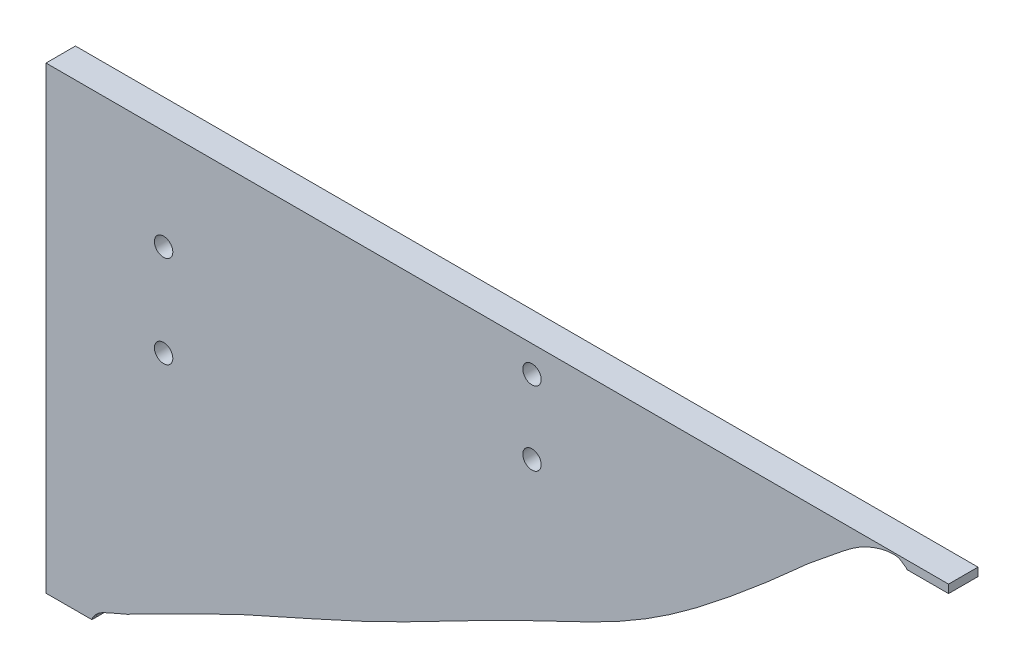
ISO-10303-21;
HEADER;
FILE_DESCRIPTION(('STEP AP214'),'2;1');
FILE_NAME('part.step','',(''),(''),'','','');
FILE_SCHEMA(('AUTOMOTIVE_DESIGN { 1 0 10303 214 1 1 1 1 }'));
ENDSEC;
DATA;
#1=APPLICATION_CONTEXT('core data for automotive mechanical design processes');
#2=APPLICATION_PROTOCOL_DEFINITION('international standard','automotive_design',2000,#1);
#3=PRODUCT_CONTEXT('',#1,'mechanical');
#4=PRODUCT('Part','Part','',(#3));
#5=PRODUCT_RELATED_PRODUCT_CATEGORY('part','',(#4));
#6=PRODUCT_DEFINITION_FORMATION('','',#4);
#7=PRODUCT_DEFINITION_CONTEXT('part definition',#1,'design');
#8=PRODUCT_DEFINITION('design','',#6,#7);
#9=PRODUCT_DEFINITION_SHAPE('','',#8);
#10=(LENGTH_UNIT() NAMED_UNIT(*) SI_UNIT(.MILLI.,.METRE.));
#11=(NAMED_UNIT(*) PLANE_ANGLE_UNIT() SI_UNIT($,.RADIAN.));
#12=(NAMED_UNIT(*) SI_UNIT($,.STERADIAN.) SOLID_ANGLE_UNIT());
#13=UNCERTAINTY_MEASURE_WITH_UNIT(LENGTH_MEASURE(1.E-05),#10,'distance_accuracy_value','');
#14=(GEOMETRIC_REPRESENTATION_CONTEXT(3) GLOBAL_UNCERTAINTY_ASSIGNED_CONTEXT((#13)) GLOBAL_UNIT_ASSIGNED_CONTEXT((#10,
#11,#12)) REPRESENTATION_CONTEXT('',''));
#15=CARTESIAN_POINT('',(0.,0.,0.));
#16=DIRECTION('',(0.,0.,1.));
#17=DIRECTION('',(1.,0.,0.));
#18=AXIS2_PLACEMENT_3D('',#15,#16,#17);
#19=CARTESIAN_POINT('',(-125.709590879201,-122.478682642915,108.));
#20=DIRECTION('',(0.,0.,-1.));
#21=DIRECTION('',(-1.,0.,0.));
#22=AXIS2_PLACEMENT_3D('',#19,#20,#21);
#23=PLANE('',#22);
#24=CARTESIAN_POINT('',(-100.,-50.,108.));
#25=DIRECTION('',(0.,0.,-1.));
#26=DIRECTION('',(-1.,0.,0.));
#27=AXIS2_PLACEMENT_3D('',#24,#25,#26);
#28=CIRCLE('',#27,2.5);
#29=CARTESIAN_POINT('',(-102.5,-50.,108.));
#30=VERTEX_POINT('',#29);
#31=EDGE_CURVE('E207',#30,#30,#28,.F.);
#32=ORIENTED_EDGE('',*,*,#31,.F.);
#33=EDGE_LOOP('',(#32));
#34=FACE_BOUND('',#33,.T.);
#35=CARTESIAN_POINT('',(0.0705666698621599,-4.96037406111782,108.));
#36=DIRECTION('',(0.,0.,-1.));
#37=DIRECTION('',(-1.,0.,0.));
#38=AXIS2_PLACEMENT_3D('',#35,#36,#37);
#39=CIRCLE('',#38,2.5);
#40=CARTESIAN_POINT('',(-2.42943333013784,-4.96037406111782,108.));
#41=VERTEX_POINT('',#40);
#42=EDGE_CURVE('E203',#41,#41,#39,.F.);
#43=ORIENTED_EDGE('',*,*,#42,.F.);
#44=EDGE_LOOP('',(#43));
#45=FACE_BOUND('',#44,.T.);
#46=CARTESIAN_POINT('',(-119.471187174751,-122.471130809259,108.));
#47=CARTESIAN_POINT('',(-123.630122907539,-122.476222875013,108.));
#48=CARTESIAN_POINT('',(-127.789058793451,-122.481190198613,108.));
#49=CARTESIAN_POINT('',(-131.947994755885,-122.486091113185,108.));
#50=B_SPLINE_CURVE_WITH_KNOTS('',3,(#46,#47,#48,#49),.UNSPECIFIED.,.F.,.F.,(4,4),(0.,1.),.UNSPECIFIED.);
#51=CARTESIAN_POINT('',(-131.947994755887,-122.486091113185,108.));
#52=VERTEX_POINT('',#51);
#53=CARTESIAN_POINT('',(-119.471187174751,-122.471130809259,108.));
#54=VERTEX_POINT('',#53);
#55=EDGE_CURVE('E161',#52,#54,#50,.F.);
#56=ORIENTED_EDGE('',*,*,#55,.T.);
#57=CARTESIAN_POINT('',(101.973979433979,0.013698260849053,108.));
#58=CARTESIAN_POINT('',(101.893968988047,0.166984138505111,108.));
#59=CARTESIAN_POINT('',(101.771299770055,0.288400068627578,108.));
#60=CARTESIAN_POINT('',(101.503848345512,0.502408670348158,108.));
#61=CARTESIAN_POINT('',(101.36241346023,0.598990176921403,108.));
#62=CARTESIAN_POINT('',(101.082794542172,0.796548339442886,108.));
#63=CARTESIAN_POINT('',(100.945170462601,0.898482490141429,108.));
#64=CARTESIAN_POINT('',(100.665094441261,1.09460512290845,108.));
#65=CARTESIAN_POINT('',(100.522713285972,1.18872323072429,108.));
#66=CARTESIAN_POINT('',(100.230483336333,1.36439237812392,108.));
#67=CARTESIAN_POINT('',(100.08053053796,1.44576839241915,108.));
#68=CARTESIAN_POINT('',(99.765217289315,1.58259134072448,108.));
#69=CARTESIAN_POINT('',(99.6019516707232,1.63772044836173,108.));
#70=CARTESIAN_POINT('',(99.1090099744496,1.76438424384136,108.));
#71=CARTESIAN_POINT('',(98.7715522229628,1.80094013855229,108.));
#72=CARTESIAN_POINT('',(98.0869994505639,1.8217870565242,108.));
#73=CARTESIAN_POINT('',(97.7480036853618,1.80598568243372,108.));
#74=CARTESIAN_POINT('',(97.0740307986182,1.74842643022347,108.));
#75=CARTESIAN_POINT('',(96.7392873768836,1.70361891387523,108.));
#76=CARTESIAN_POINT('',(96.0734113823001,1.58820195012692,108.));
#77=CARTESIAN_POINT('',(95.7422059318824,1.51811326171305,108.));
#78=CARTESIAN_POINT('',(95.0821489992707,1.36111520705629,108.));
#79=CARTESIAN_POINT('',(94.7529967765784,1.27427061987774,108.));
#80=CARTESIAN_POINT('',(93.7747109845853,0.991450069344827,108.));
#81=CARTESIAN_POINT('',(93.1327891006745,0.773124103182099,108.));
#82=CARTESIAN_POINT('',(91.8670800747321,0.28388165847653,108.));
#83=CARTESIAN_POINT('',(91.2423912767786,0.0117837667212185,108.));
#84=CARTESIAN_POINT('',(90.0303142655203,-0.580912435191883,108.));
#85=CARTESIAN_POINT('',(89.4412238687254,-0.902879760617406,108.));
#86=CARTESIAN_POINT('',(88.2935317970095,-1.5929019966438,108.));
#87=CARTESIAN_POINT('',(87.734258690213,-1.95994195247298,108.));
#88=CARTESIAN_POINT('',(86.0873841886519,-3.10783885375621,108.));
#89=CARTESIAN_POINT('',(85.0303129314778,-3.93484598951467,108.));
#90=CARTESIAN_POINT('',(83.4604028456932,-5.19908440495665,108.));
#91=CARTESIAN_POINT('',(82.9396674657765,-5.62434937576662,108.));
#92=CARTESIAN_POINT('',(81.8972265648585,-6.47333118817791,108.));
#93=CARTESIAN_POINT('',(81.3756808779274,-6.89742159394076,108.));
#94=CARTESIAN_POINT('',(79.8100103035591,-8.16842012910458,108.));
#95=CARTESIAN_POINT('',(78.7615565272537,-9.0099976081726,108.));
#96=CARTESIAN_POINT('',(76.6673995259572,-10.6965396311481,108.));
#97=CARTESIAN_POINT('',(75.6225805953905,-11.5433496884706,108.));
#98=CARTESIAN_POINT('',(73.5816333997358,-13.2932103920322,108.));
#99=CARTESIAN_POINT('',(72.5913721495397,-14.2018908697902,108.));
#100=CARTESIAN_POINT('',(71.1066651588961,-15.5656766690856,108.));
#101=CARTESIAN_POINT('',(70.6115058113128,-16.0199940183827,108.));
#102=CARTESIAN_POINT('',(69.6143034703557,-16.9208972635962,108.));
#103=CARTESIAN_POINT('',(69.1129408678756,-17.3682224668127,108.));
#104=CARTESIAN_POINT('',(67.603693709964,-18.7043567979717,108.));
#105=CARTESIAN_POINT('',(66.59186035636,-19.5886952023302,108.));
#106=CARTESIAN_POINT('',(64.567132639407,-21.3561707642167,108.));
#107=CARTESIAN_POINT('',(63.5527776883366,-22.237612210276,108.));
#108=CARTESIAN_POINT('',(60.4959231199313,-24.8658984729384,108.));
#109=CARTESIAN_POINT('',(58.4408957755934,-26.5982847523526,108.));
#110=CARTESIAN_POINT('',(54.3020776069189,-30.025262374983,108.));
#111=CARTESIAN_POINT('',(52.2170139668691,-31.7188591711943,108.));
#112=CARTESIAN_POINT('',(48.0076523246611,-35.0561982332172,108.));
#113=CARTESIAN_POINT('',(45.8839423607818,-36.7006877106739,108.));
#114=CARTESIAN_POINT('',(42.6563970751304,-39.1140781227066,108.));
#115=CARTESIAN_POINT('',(41.5734110489967,-39.9094719524732,108.));
#116=CARTESIAN_POINT('',(39.3890940344778,-41.4769489366421,108.));
#117=CARTESIAN_POINT('',(38.2876103606398,-42.2486976578092,108.));
#118=CARTESIAN_POINT('',(34.9626235983138,-44.5194079437774,108.));
#119=CARTESIAN_POINT('',(32.7154265277906,-45.9755919651268,108.));
#120=CARTESIAN_POINT('',(28.1565789488465,-48.7663462669365,108.));
#121=CARTESIAN_POINT('',(25.844659609309,-50.1004093043571,108.));
#122=CARTESIAN_POINT('',(21.1626309044534,-52.6587397352666,108.));
#123=CARTESIAN_POINT('',(18.7924300496914,-53.8828345022222,108.));
#124=CARTESIAN_POINT('',(14.0151667059843,-56.2614717923045,108.));
#125=CARTESIAN_POINT('',(11.6082785796779,-57.416343310958,108.));
#126=CARTESIAN_POINT('',(6.78794507898384,-59.7137138279604,108.));
#127=CARTESIAN_POINT('',(4.37624936070234,-60.8595141587327,108.));
#128=CARTESIAN_POINT('',(-0.434886436876133,-63.1742393292641,108.));
#129=CARTESIAN_POINT('',(-2.83552798469728,-64.340897182396,108.));
#130=CARTESIAN_POINT('',(-7.62277196387873,-66.7007025458027,108.));
#131=CARTESIAN_POINT('',(-10.0092128954907,-67.8941547813051,108.));
#132=CARTESIAN_POINT('',(-14.7685628439442,-70.3065918977408,108.));
#133=CARTESIAN_POINT('',(-17.1415078106523,-71.5255089467954,108.));
#134=CARTESIAN_POINT('',(-24.2498963427634,-75.2019707864258,108.));
#135=CARTESIAN_POINT('',(-28.9741152987787,-77.6820415890647,108.));
#136=CARTESIAN_POINT('',(-36.1063781640458,-81.3084135786796,108.));
#137=CARTESIAN_POINT('',(-38.492696401485,-82.4988876222742,108.));
#138=CARTESIAN_POINT('',(-43.2869603922871,-84.8353116664233,108.));
#139=CARTESIAN_POINT('',(-45.6947057027655,-85.9816743138878,108.));
#140=CARTESIAN_POINT('',(-50.5290698857911,-88.2355450638552,108.));
#141=CARTESIAN_POINT('',(-52.9557439981446,-89.3429394455071,108.));
#142=CARTESIAN_POINT('',(-57.8215184630571,-91.5321466091635,108.));
#143=CARTESIAN_POINT('',(-60.2603930616233,-92.61401187394,108.));
#144=CARTESIAN_POINT('',(-67.5793175713268,-95.8540866214558,108.));
#145=CARTESIAN_POINT('',(-72.4614013745636,-98.0080069595876,108.));
#146=CARTESIAN_POINT('',(-82.146017474883,-102.489944681765,108.));
#147=CARTESIAN_POINT('',(-86.9453091514087,-104.826832066426,108.));
#148=CARTESIAN_POINT('',(-94.1025266033056,-108.415134477436,108.));
#149=CARTESIAN_POINT('',(-96.4815665027202,-109.624660185784,108.));
#150=CARTESIAN_POINT('',(-100.045601934707,-111.447706488687,108.));
#151=CARTESIAN_POINT('',(-101.233071970621,-112.056448842486,108.));
#152=CARTESIAN_POINT('',(-103.608741249184,-113.272500643274,108.));
#153=CARTESIAN_POINT('',(-104.796127233449,-113.881417844694,108.));
#154=CARTESIAN_POINT('',(-107.176994995657,-115.087142303471,108.));
#155=CARTESIAN_POINT('',(-108.371613017368,-115.681947088943,108.));
#156=CARTESIAN_POINT('',(-110.179082174997,-116.542473961169,108.));
#157=CARTESIAN_POINT('',(-110.784187130763,-116.823522242278,108.));
#158=CARTESIAN_POINT('',(-112.004007351958,-117.364327335998,108.));
#159=CARTESIAN_POINT('',(-112.619903828796,-117.621467195943,108.));
#160=CARTESIAN_POINT('',(-113.858107987691,-118.121543005786,108.));
#161=CARTESIAN_POINT('',(-114.47886047634,-118.367924458755,108.));
#162=CARTESIAN_POINT('',(-115.703084551902,-118.898972892202,108.));
#163=CARTESIAN_POINT('',(-116.308761068036,-119.178754891578,108.));
#164=CARTESIAN_POINT('',(-117.174392289901,-119.693435630838,108.));
#165=CARTESIAN_POINT('',(-117.453864730266,-119.881089622349,108.));
#166=CARTESIAN_POINT('',(-117.972816576303,-120.296034235924,108.));
#167=CARTESIAN_POINT('',(-118.211620061021,-120.526542453839,108.));
#168=CARTESIAN_POINT('',(-118.656312917294,-121.024236062177,108.));
#169=CARTESIAN_POINT('',(-118.863312067159,-121.291304187632,108.));
#170=CARTESIAN_POINT('',(-119.15302720798,-121.70301544028,108.));
#171=CARTESIAN_POINT('',(-119.248092401612,-121.841267015192,108.));
#172=CARTESIAN_POINT('',(-119.368198530997,-122.063790264285,108.));
#173=CARTESIAN_POINT('',(-119.404136432369,-122.14149198223,108.));
#174=CARTESIAN_POINT('',(-119.455678339762,-122.301853212433,108.));
#175=CARTESIAN_POINT('',(-119.471584697606,-122.386794459503,108.));
#176=CARTESIAN_POINT('',(-119.471187174751,-122.471130809259,108.));
#177=B_SPLINE_CURVE_WITH_KNOTS('',3,(#57,#58,#59,#60,#61,#62,#63,#64,#65,#66,#67,#68,#69,#70,
#71,#72,#73,#74,#75,#76,#77,#78,#79,#80,#81,#82,#83,#84,#85,#86,#87,#88,#89,#90,#91,#92,#93,#94,
#95,#96,#97,#98,#99,#100,#101,#102,#103,#104,#105,#106,#107,#108,#109,#110,#111,#112,#113,#114,
#115,#116,#117,#118,#119,#120,#121,#122,#123,#124,#125,#126,#127,#128,#129,#130,#131,#132,#133,
#134,#135,#136,#137,#138,#139,#140,#141,#142,#143,#144,#145,#146,#147,#148,#149,#150,#151,#152,
#153,#154,#155,#156,#157,#158,#159,#160,#161,#162,#163,#164,#165,#166,#167,#168,#169,#170,#171,
#172,#173,#174,#175,#176),.UNSPECIFIED.,.F.,.F.,(4,2,2,2,2,2,2,2,2,2,2,2,2,2,2,2,2,2,2,2,2,2,2,
2,2,2,2,2,2,2,2,2,2,2,2,2,2,2,2,2,2,2,2,2,2,2,2,2,2,2,2,2,2,2,2,2,2,2,2,4),(0.,0.001953125,
0.00390625,0.00585937499999989,0.00781249999999989,0.00976562499999989,0.0117187499999999,
0.015625,0.01953125,0.0234375000000001,0.0273437500000002,0.0312500000000002,0.0390625000000003,
0.0468750000000003,0.0546875000000003,0.0625000000000003,0.0781250000000004,0.0859375000000004,
0.0937500000000006,0.109375000000001,0.125000000000001,0.140625000000001,0.148437500000001,
0.156250000000001,0.171875000000001,0.187500000000001,0.218750000000001,0.250000000000001,
0.281250000000001,0.296875000000001,0.3125,0.34375,0.375000000000001,0.406250000000001,
0.437500000000001,0.46875,0.5,0.53125,0.5625,0.625,0.65625,0.6875,0.71875,0.75,0.8125,0.875,
0.90625,0.921875,0.9375,0.953125,0.9609375,0.96875,0.9765625,0.984375,0.98828125,0.9921875,
0.99609375,0.998046875,0.9990234375,1.),.UNSPECIFIED.);
#178=CARTESIAN_POINT('',(101.973979433979,0.0136982608488512,108.));
#179=VERTEX_POINT('',#178);
#180=EDGE_CURVE('E88',#54,#179,#177,.F.);
#181=ORIENTED_EDGE('',*,*,#180,.T.);
#182=DIRECTION('',(0.999999999989735,4.53103772528348E-06,0.));
#183=VECTOR('',#182,1.);
#184=CARTESIAN_POINT('',(101.973979433979,0.0136982608488512,108.));
#185=LINE('',#184,#183);
#186=CARTESIAN_POINT('',(113.232370361258,0.0137492730428693,108.));
#187=VERTEX_POINT('',#186);
#188=EDGE_CURVE('E102',#179,#187,#185,.T.);
#189=ORIENTED_EDGE('',*,*,#188,.T.);
#190=DIRECTION('',(0.,1.,0.));
#191=VECTOR('',#190,1.);
#192=CARTESIAN_POINT('',(113.232370361258,2.25600000000004,108.));
#193=LINE('',#192,#191);
#194=CARTESIAN_POINT('',(113.232370361258,2.25600000000004,108.));
#195=VERTEX_POINT('',#194);
#196=EDGE_CURVE('E96',#187,#195,#193,.T.);
#197=ORIENTED_EDGE('',*,*,#196,.T.);
#198=DIRECTION('',(-1.,0.,0.));
#199=VECTOR('',#198,1.);
#200=CARTESIAN_POINT('',(113.232370361258,2.25600000000004,108.));
#201=LINE('',#200,#199);
#202=CARTESIAN_POINT('',(-131.947994755885,2.25600000000001,108.));
#203=VERTEX_POINT('',#202);
#204=EDGE_CURVE('E100',#195,#203,#201,.T.);
#205=ORIENTED_EDGE('',*,*,#204,.T.);
#206=DIRECTION('',(0.,-1.,0.));
#207=VECTOR('',#206,1.);
#208=CARTESIAN_POINT('',(-131.947994755887,-122.486091113185,108.));
#209=LINE('',#208,#207);
#210=EDGE_CURVE('E51',#203,#52,#209,.T.);
#211=ORIENTED_EDGE('',*,*,#210,.T.);
#212=EDGE_LOOP('',(#56,#181,#189,#197,#205,#211));
#213=FACE_BOUND('',#212,.T.);
#214=CARTESIAN_POINT('',(0.0705666698621599,-25.,108.));
#215=DIRECTION('',(0.,0.,-1.));
#216=DIRECTION('',(-1.,0.,0.));
#217=AXIS2_PLACEMENT_3D('',#214,#215,#216);
#218=CIRCLE('',#217,2.5);
#219=CARTESIAN_POINT('',(-2.42943333013784,-25.,108.));
#220=VERTEX_POINT('',#219);
#221=EDGE_CURVE('E204',#220,#220,#218,.F.);
#222=ORIENTED_EDGE('',*,*,#221,.F.);
#223=EDGE_LOOP('',(#222));
#224=FACE_BOUND('',#223,.T.);
#225=CARTESIAN_POINT('',(-100.,-25.,108.));
#226=DIRECTION('',(0.,0.,-1.));
#227=DIRECTION('',(-1.,0.,0.));
#228=AXIS2_PLACEMENT_3D('',#225,#226,#227);
#229=CIRCLE('',#228,2.5);
#230=CARTESIAN_POINT('',(-102.5,-25.,108.));
#231=VERTEX_POINT('',#230);
#232=EDGE_CURVE('E210',#231,#231,#229,.F.);
#233=ORIENTED_EDGE('',*,*,#232,.F.);
#234=EDGE_LOOP('',(#233));
#235=FACE_BOUND('',#234,.T.);
#236=ADVANCED_FACE('F30',(#34,#45,#213,#224,#235),#23,.F.);
#237=CARTESIAN_POINT('',(-125.709590879201,-122.478682642915,99.9999999999997));
#238=DIRECTION('',(0.,0.,-1.));
#239=DIRECTION('',(-1.,0.,0.));
#240=AXIS2_PLACEMENT_3D('',#237,#238,#239);
#241=PLANE('',#240);
#242=CARTESIAN_POINT('',(-100.,-50.,99.9999999999997));
#243=DIRECTION('',(0.,0.,-1.));
#244=DIRECTION('',(-1.,0.,0.));
#245=AXIS2_PLACEMENT_3D('',#242,#243,#244);
#246=CIRCLE('',#245,2.5);
#247=CARTESIAN_POINT('',(-102.5,-50.,99.9999999999997));
#248=VERTEX_POINT('',#247);
#249=EDGE_CURVE('E208',#248,#248,#246,.F.);
#250=ORIENTED_EDGE('',*,*,#249,.T.);
#251=EDGE_LOOP('',(#250));
#252=FACE_BOUND('',#251,.T.);
#253=CARTESIAN_POINT('',(0.0705666698621599,-4.96037406111782,99.9999999999997));
#254=DIRECTION('',(0.,0.,-1.));
#255=DIRECTION('',(-1.,0.,0.));
#256=AXIS2_PLACEMENT_3D('',#253,#254,#255);
#257=CIRCLE('',#256,2.5);
#258=CARTESIAN_POINT('',(-2.42943333013784,-4.96037406111782,99.9999999999997));
#259=VERTEX_POINT('',#258);
#260=EDGE_CURVE('E200',#259,#259,#257,.F.);
#261=ORIENTED_EDGE('',*,*,#260,.T.);
#262=EDGE_LOOP('',(#261));
#263=FACE_BOUND('',#262,.T.);
#264=CARTESIAN_POINT('',(-131.947994755885,-122.486091113185,99.9999999999997));
#265=CARTESIAN_POINT('',(-127.789058793451,-122.481190198613,99.9999999999997));
#266=CARTESIAN_POINT('',(-123.630122907539,-122.476222875013,99.9999999999997));
#267=CARTESIAN_POINT('',(-119.471187174751,-122.471130809259,99.9999999999997));
#268=B_SPLINE_CURVE_WITH_KNOTS('',3,(#264,#265,#266,#267),.UNSPECIFIED.,.F.,.F.,(4,4),(0.,1.),.UNSPECIFIED.);
#269=CARTESIAN_POINT('',(-131.947994755887,-122.486091113185,99.9999999999997));
#270=VERTEX_POINT('',#269);
#271=CARTESIAN_POINT('',(-119.471187174751,-122.471130809259,99.9999999999997));
#272=VERTEX_POINT('',#271);
#273=EDGE_CURVE('E178',#270,#272,#268,.T.);
#274=ORIENTED_EDGE('',*,*,#273,.F.);
#275=DIRECTION('',(0.,-1.,0.));
#276=VECTOR('',#275,1.);
#277=CARTESIAN_POINT('',(-131.947994755887,-122.486091113185,99.9999999999997));
#278=LINE('',#277,#276);
#279=CARTESIAN_POINT('',(-131.947994755885,2.25600000000001,99.9999999999997));
#280=VERTEX_POINT('',#279);
#281=EDGE_CURVE('E80',#280,#270,#278,.T.);
#282=ORIENTED_EDGE('',*,*,#281,.F.);
#283=DIRECTION('',(-1.,0.,0.));
#284=VECTOR('',#283,1.);
#285=CARTESIAN_POINT('',(113.232370361258,2.25600000000004,99.9999999999997));
#286=LINE('',#285,#284);
#287=CARTESIAN_POINT('',(113.232370361258,2.25600000000004,99.9999999999997));
#288=VERTEX_POINT('',#287);
#289=EDGE_CURVE('E74',#288,#280,#286,.T.);
#290=ORIENTED_EDGE('',*,*,#289,.F.);
#291=DIRECTION('',(0.,1.,0.));
#292=VECTOR('',#291,1.);
#293=CARTESIAN_POINT('',(113.232370361258,2.25600000000004,99.9999999999997));
#294=LINE('',#293,#292);
#295=CARTESIAN_POINT('',(113.232370361258,0.0137492730428693,99.9999999999997));
#296=VERTEX_POINT('',#295);
#297=EDGE_CURVE('E110',#296,#288,#294,.T.);
#298=ORIENTED_EDGE('',*,*,#297,.F.);
#299=DIRECTION('',(0.999999999989735,4.53103772528348E-06,0.));
#300=VECTOR('',#299,1.);
#301=CARTESIAN_POINT('',(101.973979433979,0.0136982608488512,99.9999999999997));
#302=LINE('',#301,#300);
#303=CARTESIAN_POINT('',(101.973979433979,0.0136982608488512,99.9999999999997));
#304=VERTEX_POINT('',#303);
#305=EDGE_CURVE('E121',#304,#296,#302,.T.);
#306=ORIENTED_EDGE('',*,*,#305,.F.);
#307=CARTESIAN_POINT('',(-119.471187174751,-122.471130809259,99.9999999999997));
#308=CARTESIAN_POINT('',(-119.471584697606,-122.386794459503,99.9999999999997));
#309=CARTESIAN_POINT('',(-119.455678339762,-122.301853212433,99.9999999999997));
#310=CARTESIAN_POINT('',(-119.404136432369,-122.14149198223,99.9999999999997));
#311=CARTESIAN_POINT('',(-119.368198530997,-122.063790264285,99.9999999999997));
#312=CARTESIAN_POINT('',(-119.248092401612,-121.841267015192,99.9999999999997));
#313=CARTESIAN_POINT('',(-119.15302720798,-121.70301544028,99.9999999999997));
#314=CARTESIAN_POINT('',(-118.863312067159,-121.291304187632,99.9999999999997));
#315=CARTESIAN_POINT('',(-118.656312917294,-121.024236062177,99.9999999999997));
#316=CARTESIAN_POINT('',(-118.211620061021,-120.526542453839,99.9999999999997));
#317=CARTESIAN_POINT('',(-117.972816576303,-120.296034235924,99.9999999999997));
#318=CARTESIAN_POINT('',(-117.453864730266,-119.881089622349,99.9999999999997));
#319=CARTESIAN_POINT('',(-117.174392289901,-119.693435630838,99.9999999999997));
#320=CARTESIAN_POINT('',(-116.308761068036,-119.178754891578,99.9999999999997));
#321=CARTESIAN_POINT('',(-115.703084551902,-118.898972892202,99.9999999999997));
#322=CARTESIAN_POINT('',(-114.47886047634,-118.367924458755,99.9999999999997));
#323=CARTESIAN_POINT('',(-113.858107987691,-118.121543005786,99.9999999999997));
#324=CARTESIAN_POINT('',(-112.619903828796,-117.621467195943,99.9999999999997));
#325=CARTESIAN_POINT('',(-112.004007351958,-117.364327335998,99.9999999999997));
#326=CARTESIAN_POINT('',(-110.784187130763,-116.823522242278,99.9999999999997));
#327=CARTESIAN_POINT('',(-110.179082174997,-116.542473961169,99.9999999999997));
#328=CARTESIAN_POINT('',(-108.371613017368,-115.681947088943,99.9999999999997));
#329=CARTESIAN_POINT('',(-107.176994995657,-115.087142303471,99.9999999999997));
#330=CARTESIAN_POINT('',(-104.796127233449,-113.881417844694,99.9999999999997));
#331=CARTESIAN_POINT('',(-103.608741249184,-113.272500643274,99.9999999999997));
#332=CARTESIAN_POINT('',(-101.233071970621,-112.056448842486,99.9999999999997));
#333=CARTESIAN_POINT('',(-100.045601934707,-111.447706488687,99.9999999999997));
#334=CARTESIAN_POINT('',(-96.4815665027202,-109.624660185784,99.9999999999997));
#335=CARTESIAN_POINT('',(-94.1025266033056,-108.415134477436,99.9999999999997));
#336=CARTESIAN_POINT('',(-86.9453091514087,-104.826832066426,99.9999999999997));
#337=CARTESIAN_POINT('',(-82.146017474883,-102.489944681765,99.9999999999997));
#338=CARTESIAN_POINT('',(-72.4614013745636,-98.0080069595876,99.9999999999997));
#339=CARTESIAN_POINT('',(-67.5793175713268,-95.8540866214558,99.9999999999997));
#340=CARTESIAN_POINT('',(-60.2603930616233,-92.61401187394,99.9999999999997));
#341=CARTESIAN_POINT('',(-57.8215184630571,-91.5321466091635,99.9999999999997));
#342=CARTESIAN_POINT('',(-52.9557439981446,-89.3429394455071,99.9999999999997));
#343=CARTESIAN_POINT('',(-50.5290698857911,-88.2355450638552,99.9999999999997));
#344=CARTESIAN_POINT('',(-45.6947057027655,-85.9816743138878,99.9999999999997));
#345=CARTESIAN_POINT('',(-43.2869603922871,-84.8353116664233,99.9999999999997));
#346=CARTESIAN_POINT('',(-38.492696401485,-82.4988876222742,99.9999999999997));
#347=CARTESIAN_POINT('',(-36.1063781640458,-81.3084135786796,99.9999999999997));
#348=CARTESIAN_POINT('',(-28.9741152987787,-77.6820415890647,99.9999999999997));
#349=CARTESIAN_POINT('',(-24.2498963427634,-75.2019707864258,99.9999999999997));
#350=CARTESIAN_POINT('',(-17.1415078106523,-71.5255089467954,99.9999999999997));
#351=CARTESIAN_POINT('',(-14.7685628439442,-70.3065918977408,99.9999999999997));
#352=CARTESIAN_POINT('',(-10.0092128954907,-67.8941547813051,99.9999999999997));
#353=CARTESIAN_POINT('',(-7.62277196387873,-66.7007025458027,99.9999999999997));
#354=CARTESIAN_POINT('',(-2.83552798469728,-64.340897182396,99.9999999999997));
#355=CARTESIAN_POINT('',(-0.434886436876133,-63.1742393292641,99.9999999999997));
#356=CARTESIAN_POINT('',(4.37624936070234,-60.8595141587327,99.9999999999997));
#357=CARTESIAN_POINT('',(6.78794507898384,-59.7137138279604,99.9999999999997));
#358=CARTESIAN_POINT('',(11.6082785796779,-57.416343310958,99.9999999999997));
#359=CARTESIAN_POINT('',(14.0151667059843,-56.2614717923045,99.9999999999997));
#360=CARTESIAN_POINT('',(18.7924300496914,-53.8828345022222,99.9999999999997));
#361=CARTESIAN_POINT('',(21.1626309044534,-52.6587397352666,99.9999999999997));
#362=CARTESIAN_POINT('',(25.844659609309,-50.1004093043571,99.9999999999997));
#363=CARTESIAN_POINT('',(28.1565789488465,-48.7663462669365,99.9999999999997));
#364=CARTESIAN_POINT('',(32.7154265277906,-45.9755919651268,99.9999999999997));
#365=CARTESIAN_POINT('',(34.9626235983138,-44.5194079437774,99.9999999999997));
#366=CARTESIAN_POINT('',(38.2876103606398,-42.2486976578092,99.9999999999997));
#367=CARTESIAN_POINT('',(39.3890940344778,-41.4769489366421,99.9999999999997));
#368=CARTESIAN_POINT('',(41.5734110489967,-39.9094719524732,99.9999999999997));
#369=CARTESIAN_POINT('',(42.6563970751304,-39.1140781227066,99.9999999999997));
#370=CARTESIAN_POINT('',(45.8839423607818,-36.7006877106739,99.9999999999997));
#371=CARTESIAN_POINT('',(48.0076523246611,-35.0561982332172,99.9999999999997));
#372=CARTESIAN_POINT('',(52.2170139668691,-31.7188591711943,99.9999999999997));
#373=CARTESIAN_POINT('',(54.3020776069189,-30.025262374983,99.9999999999997));
#374=CARTESIAN_POINT('',(58.4408957755934,-26.5982847523526,99.9999999999997));
#375=CARTESIAN_POINT('',(60.4959231199313,-24.8658984729384,99.9999999999997));
#376=CARTESIAN_POINT('',(63.5527776883366,-22.237612210276,99.9999999999997));
#377=CARTESIAN_POINT('',(64.567132639407,-21.3561707642167,99.9999999999997));
#378=CARTESIAN_POINT('',(66.59186035636,-19.5886952023302,99.9999999999997));
#379=CARTESIAN_POINT('',(67.603693709964,-18.7043567979717,99.9999999999997));
#380=CARTESIAN_POINT('',(69.1129408678756,-17.3682224668127,99.9999999999997));
#381=CARTESIAN_POINT('',(69.6143034703557,-16.9208972635962,99.9999999999997));
#382=CARTESIAN_POINT('',(70.6115058113128,-16.0199940183827,99.9999999999997));
#383=CARTESIAN_POINT('',(71.1066651588961,-15.5656766690856,99.9999999999997));
#384=CARTESIAN_POINT('',(72.5913721495397,-14.2018908697902,99.9999999999997));
#385=CARTESIAN_POINT('',(73.5816333997358,-13.2932103920322,99.9999999999997));
#386=CARTESIAN_POINT('',(75.6225805953905,-11.5433496884706,99.9999999999997));
#387=CARTESIAN_POINT('',(76.6673995259572,-10.6965396311481,99.9999999999997));
#388=CARTESIAN_POINT('',(78.7615565272537,-9.0099976081726,99.9999999999997));
#389=CARTESIAN_POINT('',(79.8100103035591,-8.16842012910458,99.9999999999997));
#390=CARTESIAN_POINT('',(81.3756808779274,-6.89742159394076,99.9999999999997));
#391=CARTESIAN_POINT('',(81.8972265648585,-6.47333118817791,99.9999999999997));
#392=CARTESIAN_POINT('',(82.9396674657765,-5.62434937576662,99.9999999999997));
#393=CARTESIAN_POINT('',(83.4604028456932,-5.19908440495665,99.9999999999997));
#394=CARTESIAN_POINT('',(85.0303129314778,-3.93484598951467,99.9999999999997));
#395=CARTESIAN_POINT('',(86.0873841886519,-3.10783885375621,99.9999999999997));
#396=CARTESIAN_POINT('',(87.734258690213,-1.95994195247298,99.9999999999997));
#397=CARTESIAN_POINT('',(88.2935317970095,-1.5929019966438,99.9999999999997));
#398=CARTESIAN_POINT('',(89.4412238687254,-0.902879760617406,99.9999999999997));
#399=CARTESIAN_POINT('',(90.0303142655203,-0.580912435191883,99.9999999999997));
#400=CARTESIAN_POINT('',(91.2423912767786,0.0117837667212185,99.9999999999997));
#401=CARTESIAN_POINT('',(91.8670800747321,0.28388165847653,99.9999999999997));
#402=CARTESIAN_POINT('',(93.1327891006745,0.773124103182099,99.9999999999997));
#403=CARTESIAN_POINT('',(93.7747109845853,0.991450069344827,99.9999999999997));
#404=CARTESIAN_POINT('',(94.7529967765784,1.27427061987774,99.9999999999997));
#405=CARTESIAN_POINT('',(95.0821489992707,1.36111520705629,99.9999999999997));
#406=CARTESIAN_POINT('',(95.7422059318824,1.51811326171305,99.9999999999997));
#407=CARTESIAN_POINT('',(96.0734113823001,1.58820195012692,99.9999999999997));
#408=CARTESIAN_POINT('',(96.7392873768836,1.70361891387523,99.9999999999997));
#409=CARTESIAN_POINT('',(97.0740307986182,1.74842643022347,99.9999999999997));
#410=CARTESIAN_POINT('',(97.7480036853618,1.80598568243372,99.9999999999997));
#411=CARTESIAN_POINT('',(98.0869994505639,1.8217870565242,99.9999999999997));
#412=CARTESIAN_POINT('',(98.7715522229628,1.80094013855229,99.9999999999997));
#413=CARTESIAN_POINT('',(99.1090099744496,1.76438424384136,99.9999999999997));
#414=CARTESIAN_POINT('',(99.6019516707232,1.63772044836173,99.9999999999997));
#415=CARTESIAN_POINT('',(99.765217289315,1.58259134072448,99.9999999999997));
#416=CARTESIAN_POINT('',(100.08053053796,1.44576839241915,99.9999999999997));
#417=CARTESIAN_POINT('',(100.230483336333,1.36439237812392,99.9999999999997));
#418=CARTESIAN_POINT('',(100.522713285972,1.18872323072429,99.9999999999997));
#419=CARTESIAN_POINT('',(100.665094441261,1.09460512290845,99.9999999999997));
#420=CARTESIAN_POINT('',(100.945170462601,0.898482490141429,99.9999999999997));
#421=CARTESIAN_POINT('',(101.082794542172,0.796548339442886,99.9999999999997));
#422=CARTESIAN_POINT('',(101.36241346023,0.598990176921403,99.9999999999997));
#423=CARTESIAN_POINT('',(101.503848345512,0.502408670348158,99.9999999999997));
#424=CARTESIAN_POINT('',(101.771299770055,0.288400068627578,99.9999999999997));
#425=CARTESIAN_POINT('',(101.893968988047,0.166984138505111,99.9999999999997));
#426=CARTESIAN_POINT('',(101.973979433979,0.013698260849053,99.9999999999997));
#427=B_SPLINE_CURVE_WITH_KNOTS('',3,(#307,#308,#309,#310,#311,#312,#313,#314,#315,#316,#317,
#318,#319,#320,#321,#322,#323,#324,#325,#326,#327,#328,#329,#330,#331,#332,#333,#334,#335,#336,
#337,#338,#339,#340,#341,#342,#343,#344,#345,#346,#347,#348,#349,#350,#351,#352,#353,#354,#355,
#356,#357,#358,#359,#360,#361,#362,#363,#364,#365,#366,#367,#368,#369,#370,#371,#372,#373,#374,
#375,#376,#377,#378,#379,#380,#381,#382,#383,#384,#385,#386,#387,#388,#389,#390,#391,#392,#393,
#394,#395,#396,#397,#398,#399,#400,#401,#402,#403,#404,#405,#406,#407,#408,#409,#410,#411,#412,
#413,#414,#415,#416,#417,#418,#419,#420,#421,#422,#423,#424,#425,#426),.UNSPECIFIED.,.F.,.F.,(4,
2,2,2,2,2,2,2,2,2,2,2,2,2,2,2,2,2,2,2,2,2,2,2,2,2,2,2,2,2,2,2,2,2,2,2,2,2,2,2,2,2,2,2,2,2,2,2,2,
2,2,2,2,2,2,2,2,2,2,4),(0.,0.000976562500000101,0.0019531250000002,0.00390625000000026,
0.00781250000000025,0.0117187500000002,0.0156250000000002,0.0234375000000002,0.0312500000000002,
0.0390625000000002,0.0468750000000001,0.0625000000000002,0.0781250000000002,0.0937500000000003,
0.125,0.1875,0.25,0.28125,0.3125,0.34375,0.375,0.4375,0.46875,0.5,0.53125,0.562499999999999,
0.593749999999999,0.624999999999999,0.65625,0.6875,0.703124999999999,0.718749999999999,
0.749999999999999,0.781249999999999,0.812499999999999,0.828124999999999,0.843749999999999,
0.851562499999999,0.859374999999999,0.874999999999999,0.890624999999999,0.906249999999999,
0.9140625,0.921875,0.9375,0.9453125,0.953125,0.9609375,0.96875,0.97265625,0.9765625,0.98046875,
0.984375,0.98828125,0.990234375,0.9921875,0.994140625,0.99609375,0.998046875,1.),.UNSPECIFIED.);
#428=EDGE_CURVE('E258',#272,#304,#427,.T.);
#429=ORIENTED_EDGE('',*,*,#428,.F.);
#430=EDGE_LOOP('',(#274,#282,#290,#298,#306,#429));
#431=FACE_BOUND('',#430,.T.);
#432=CARTESIAN_POINT('',(0.0705666698621599,-25.,99.9999999999997));
#433=DIRECTION('',(0.,0.,-1.));
#434=DIRECTION('',(-1.,0.,0.));
#435=AXIS2_PLACEMENT_3D('',#432,#433,#434);
#436=CIRCLE('',#435,2.5);
#437=CARTESIAN_POINT('',(-2.42943333013784,-25.,99.9999999999997));
#438=VERTEX_POINT('',#437);
#439=EDGE_CURVE('E205',#438,#438,#436,.F.);
#440=ORIENTED_EDGE('',*,*,#439,.T.);
#441=EDGE_LOOP('',(#440));
#442=FACE_BOUND('',#441,.T.);
#443=CARTESIAN_POINT('',(-100.,-25.,99.9999999999997));
#444=DIRECTION('',(0.,0.,-1.));
#445=DIRECTION('',(-1.,0.,0.));
#446=AXIS2_PLACEMENT_3D('',#443,#444,#445);
#447=CIRCLE('',#446,2.5);
#448=CARTESIAN_POINT('',(-102.5,-25.,99.9999999999997));
#449=VERTEX_POINT('',#448);
#450=EDGE_CURVE('E36',#449,#449,#447,.F.);
#451=ORIENTED_EDGE('',*,*,#450,.T.);
#452=EDGE_LOOP('',(#451));
#453=FACE_BOUND('',#452,.T.);
#454=ADVANCED_FACE('F139',(#252,#263,#431,#442,#453),#241,.T.);
#455=CARTESIAN_POINT('',(-131.947994755885,-122.486091113185,108.));
#456=CARTESIAN_POINT('',(-127.789058793451,-122.481190198613,108.));
#457=CARTESIAN_POINT('',(-123.630122907539,-122.476222875013,108.));
#458=CARTESIAN_POINT('',(-119.471187174751,-122.471130809259,108.));
#459=B_SPLINE_CURVE_WITH_KNOTS('',3,(#455,#456,#457,#458),.UNSPECIFIED.,.F.,.F.,(4,4),(0.,1.),.UNSPECIFIED.);
#460=DIRECTION('',(0.,0.,-1.));
#461=VECTOR('',#460,1.);
#462=SURFACE_OF_LINEAR_EXTRUSION('',#459,#461);
#463=ORIENTED_EDGE('',*,*,#273,.T.);
#464=DIRECTION('',(0.,0.,-1.));
#465=VECTOR('',#464,1.);
#466=CARTESIAN_POINT('',(-119.471187174751,-122.471130809259,108.));
#467=LINE('',#466,#465);
#468=EDGE_CURVE('E11',#54,#272,#467,.T.);
#469=ORIENTED_EDGE('',*,*,#468,.F.);
#470=ORIENTED_EDGE('',*,*,#55,.F.);
#471=DIRECTION('',(0.,0.,-1.));
#472=VECTOR('',#471,1.);
#473=CARTESIAN_POINT('',(-131.947994755887,-122.486091113185,108.));
#474=LINE('',#473,#472);
#475=EDGE_CURVE('E116',#52,#270,#474,.T.);
#476=ORIENTED_EDGE('',*,*,#475,.T.);
#477=EDGE_LOOP('',(#463,#469,#470,#476));
#478=FACE_BOUND('',#477,.T.);
#479=ADVANCED_FACE('F32',(#478),#462,.F.);
#480=CARTESIAN_POINT('',(-119.471187174751,-122.471130809259,108.));
#481=CARTESIAN_POINT('',(-119.471584697606,-122.386794459503,108.));
#482=CARTESIAN_POINT('',(-119.455678339762,-122.301853212433,108.));
#483=CARTESIAN_POINT('',(-119.404136432369,-122.14149198223,108.));
#484=CARTESIAN_POINT('',(-119.368198530997,-122.063790264285,108.));
#485=CARTESIAN_POINT('',(-119.248092401612,-121.841267015192,108.));
#486=CARTESIAN_POINT('',(-119.15302720798,-121.70301544028,108.));
#487=CARTESIAN_POINT('',(-118.863312067159,-121.291304187632,108.));
#488=CARTESIAN_POINT('',(-118.656312917294,-121.024236062177,108.));
#489=CARTESIAN_POINT('',(-118.211620061021,-120.526542453839,108.));
#490=CARTESIAN_POINT('',(-117.972816576303,-120.296034235924,108.));
#491=CARTESIAN_POINT('',(-117.453864730266,-119.881089622349,108.));
#492=CARTESIAN_POINT('',(-117.174392289901,-119.693435630838,108.));
#493=CARTESIAN_POINT('',(-116.308761068036,-119.178754891578,108.));
#494=CARTESIAN_POINT('',(-115.703084551902,-118.898972892202,108.));
#495=CARTESIAN_POINT('',(-114.47886047634,-118.367924458755,108.));
#496=CARTESIAN_POINT('',(-113.858107987691,-118.121543005786,108.));
#497=CARTESIAN_POINT('',(-112.619903828796,-117.621467195943,108.));
#498=CARTESIAN_POINT('',(-112.004007351958,-117.364327335998,108.));
#499=CARTESIAN_POINT('',(-110.784187130763,-116.823522242278,108.));
#500=CARTESIAN_POINT('',(-110.179082174997,-116.542473961169,108.));
#501=CARTESIAN_POINT('',(-108.371613017368,-115.681947088943,108.));
#502=CARTESIAN_POINT('',(-107.176994995657,-115.087142303471,108.));
#503=CARTESIAN_POINT('',(-104.796127233449,-113.881417844694,108.));
#504=CARTESIAN_POINT('',(-103.608741249184,-113.272500643274,108.));
#505=CARTESIAN_POINT('',(-101.233071970621,-112.056448842486,108.));
#506=CARTESIAN_POINT('',(-100.045601934707,-111.447706488687,108.));
#507=CARTESIAN_POINT('',(-96.4815665027202,-109.624660185784,108.));
#508=CARTESIAN_POINT('',(-94.1025266033056,-108.415134477436,108.));
#509=CARTESIAN_POINT('',(-86.9453091514087,-104.826832066426,108.));
#510=CARTESIAN_POINT('',(-82.146017474883,-102.489944681765,108.));
#511=CARTESIAN_POINT('',(-72.4614013745636,-98.0080069595876,108.));
#512=CARTESIAN_POINT('',(-67.5793175713268,-95.8540866214558,108.));
#513=CARTESIAN_POINT('',(-60.2603930616233,-92.61401187394,108.));
#514=CARTESIAN_POINT('',(-57.8215184630571,-91.5321466091635,108.));
#515=CARTESIAN_POINT('',(-52.9557439981446,-89.3429394455071,108.));
#516=CARTESIAN_POINT('',(-50.5290698857911,-88.2355450638552,108.));
#517=CARTESIAN_POINT('',(-45.6947057027655,-85.9816743138878,108.));
#518=CARTESIAN_POINT('',(-43.2869603922871,-84.8353116664233,108.));
#519=CARTESIAN_POINT('',(-38.492696401485,-82.4988876222742,108.));
#520=CARTESIAN_POINT('',(-36.1063781640458,-81.3084135786796,108.));
#521=CARTESIAN_POINT('',(-28.9741152987787,-77.6820415890647,108.));
#522=CARTESIAN_POINT('',(-24.2498963427634,-75.2019707864258,108.));
#523=CARTESIAN_POINT('',(-17.1415078106523,-71.5255089467954,108.));
#524=CARTESIAN_POINT('',(-14.7685628439442,-70.3065918977408,108.));
#525=CARTESIAN_POINT('',(-10.0092128954907,-67.8941547813051,108.));
#526=CARTESIAN_POINT('',(-7.62277196387873,-66.7007025458027,108.));
#527=CARTESIAN_POINT('',(-2.83552798469728,-64.340897182396,108.));
#528=CARTESIAN_POINT('',(-0.434886436876133,-63.1742393292641,108.));
#529=CARTESIAN_POINT('',(4.37624936070234,-60.8595141587327,108.));
#530=CARTESIAN_POINT('',(6.78794507898384,-59.7137138279604,108.));
#531=CARTESIAN_POINT('',(11.6082785796779,-57.416343310958,108.));
#532=CARTESIAN_POINT('',(14.0151667059843,-56.2614717923045,108.));
#533=CARTESIAN_POINT('',(18.7924300496914,-53.8828345022222,108.));
#534=CARTESIAN_POINT('',(21.1626309044534,-52.6587397352666,108.));
#535=CARTESIAN_POINT('',(25.844659609309,-50.1004093043571,108.));
#536=CARTESIAN_POINT('',(28.1565789488465,-48.7663462669365,108.));
#537=CARTESIAN_POINT('',(32.7154265277906,-45.9755919651268,108.));
#538=CARTESIAN_POINT('',(34.9626235983138,-44.5194079437774,108.));
#539=CARTESIAN_POINT('',(38.2876103606398,-42.2486976578092,108.));
#540=CARTESIAN_POINT('',(39.3890940344778,-41.4769489366421,108.));
#541=CARTESIAN_POINT('',(41.5734110489967,-39.9094719524732,108.));
#542=CARTESIAN_POINT('',(42.6563970751304,-39.1140781227066,108.));
#543=CARTESIAN_POINT('',(45.8839423607818,-36.7006877106739,108.));
#544=CARTESIAN_POINT('',(48.0076523246611,-35.0561982332172,108.));
#545=CARTESIAN_POINT('',(52.2170139668691,-31.7188591711943,108.));
#546=CARTESIAN_POINT('',(54.3020776069189,-30.025262374983,108.));
#547=CARTESIAN_POINT('',(58.4408957755934,-26.5982847523526,108.));
#548=CARTESIAN_POINT('',(60.4959231199313,-24.8658984729384,108.));
#549=CARTESIAN_POINT('',(63.5527776883366,-22.237612210276,108.));
#550=CARTESIAN_POINT('',(64.567132639407,-21.3561707642167,108.));
#551=CARTESIAN_POINT('',(66.59186035636,-19.5886952023302,108.));
#552=CARTESIAN_POINT('',(67.603693709964,-18.7043567979717,108.));
#553=CARTESIAN_POINT('',(69.1129408678756,-17.3682224668127,108.));
#554=CARTESIAN_POINT('',(69.6143034703557,-16.9208972635962,108.));
#555=CARTESIAN_POINT('',(70.6115058113128,-16.0199940183827,108.));
#556=CARTESIAN_POINT('',(71.1066651588961,-15.5656766690856,108.));
#557=CARTESIAN_POINT('',(72.5913721495397,-14.2018908697902,108.));
#558=CARTESIAN_POINT('',(73.5816333997358,-13.2932103920322,108.));
#559=CARTESIAN_POINT('',(75.6225805953905,-11.5433496884706,108.));
#560=CARTESIAN_POINT('',(76.6673995259572,-10.6965396311481,108.));
#561=CARTESIAN_POINT('',(78.7615565272537,-9.0099976081726,108.));
#562=CARTESIAN_POINT('',(79.8100103035591,-8.16842012910458,108.));
#563=CARTESIAN_POINT('',(81.3756808779274,-6.89742159394076,108.));
#564=CARTESIAN_POINT('',(81.8972265648585,-6.47333118817791,108.));
#565=CARTESIAN_POINT('',(82.9396674657765,-5.62434937576662,108.));
#566=CARTESIAN_POINT('',(83.4604028456932,-5.19908440495665,108.));
#567=CARTESIAN_POINT('',(85.0303129314778,-3.93484598951467,108.));
#568=CARTESIAN_POINT('',(86.0873841886519,-3.10783885375621,108.));
#569=CARTESIAN_POINT('',(87.734258690213,-1.95994195247298,108.));
#570=CARTESIAN_POINT('',(88.2935317970095,-1.5929019966438,108.));
#571=CARTESIAN_POINT('',(89.4412238687254,-0.902879760617406,108.));
#572=CARTESIAN_POINT('',(90.0303142655203,-0.580912435191883,108.));
#573=CARTESIAN_POINT('',(91.2423912767786,0.0117837667212185,108.));
#574=CARTESIAN_POINT('',(91.8670800747321,0.28388165847653,108.));
#575=CARTESIAN_POINT('',(93.1327891006745,0.773124103182099,108.));
#576=CARTESIAN_POINT('',(93.7747109845853,0.991450069344827,108.));
#577=CARTESIAN_POINT('',(94.7529967765784,1.27427061987774,108.));
#578=CARTESIAN_POINT('',(95.0821489992707,1.36111520705629,108.));
#579=CARTESIAN_POINT('',(95.7422059318824,1.51811326171305,108.));
#580=CARTESIAN_POINT('',(96.0734113823001,1.58820195012692,108.));
#581=CARTESIAN_POINT('',(96.7392873768836,1.70361891387523,108.));
#582=CARTESIAN_POINT('',(97.0740307986182,1.74842643022347,108.));
#583=CARTESIAN_POINT('',(97.7480036853618,1.80598568243372,108.));
#584=CARTESIAN_POINT('',(98.0869994505639,1.8217870565242,108.));
#585=CARTESIAN_POINT('',(98.7715522229628,1.80094013855229,108.));
#586=CARTESIAN_POINT('',(99.1090099744496,1.76438424384136,108.));
#587=CARTESIAN_POINT('',(99.6019516707232,1.63772044836173,108.));
#588=CARTESIAN_POINT('',(99.765217289315,1.58259134072448,108.));
#589=CARTESIAN_POINT('',(100.08053053796,1.44576839241915,108.));
#590=CARTESIAN_POINT('',(100.230483336333,1.36439237812392,108.));
#591=CARTESIAN_POINT('',(100.522713285972,1.18872323072429,108.));
#592=CARTESIAN_POINT('',(100.665094441261,1.09460512290845,108.));
#593=CARTESIAN_POINT('',(100.945170462601,0.898482490141429,108.));
#594=CARTESIAN_POINT('',(101.082794542172,0.796548339442886,108.));
#595=CARTESIAN_POINT('',(101.36241346023,0.598990176921403,108.));
#596=CARTESIAN_POINT('',(101.503848345512,0.502408670348158,108.));
#597=CARTESIAN_POINT('',(101.771299770055,0.288400068627578,108.));
#598=CARTESIAN_POINT('',(101.893968988047,0.166984138505111,108.));
#599=CARTESIAN_POINT('',(101.973979433979,0.013698260849053,108.));
#600=B_SPLINE_CURVE_WITH_KNOTS('',3,(#480,#481,#482,#483,#484,#485,#486,#487,#488,#489,#490,
#491,#492,#493,#494,#495,#496,#497,#498,#499,#500,#501,#502,#503,#504,#505,#506,#507,#508,#509,
#510,#511,#512,#513,#514,#515,#516,#517,#518,#519,#520,#521,#522,#523,#524,#525,#526,#527,#528,
#529,#530,#531,#532,#533,#534,#535,#536,#537,#538,#539,#540,#541,#542,#543,#544,#545,#546,#547,
#548,#549,#550,#551,#552,#553,#554,#555,#556,#557,#558,#559,#560,#561,#562,#563,#564,#565,#566,
#567,#568,#569,#570,#571,#572,#573,#574,#575,#576,#577,#578,#579,#580,#581,#582,#583,#584,#585,
#586,#587,#588,#589,#590,#591,#592,#593,#594,#595,#596,#597,#598,#599),.UNSPECIFIED.,.F.,.F.,(4,
2,2,2,2,2,2,2,2,2,2,2,2,2,2,2,2,2,2,2,2,2,2,2,2,2,2,2,2,2,2,2,2,2,2,2,2,2,2,2,2,2,2,2,2,2,2,2,2,
2,2,2,2,2,2,2,2,2,2,4),(0.,0.000976562500000101,0.0019531250000002,0.00390625000000026,
0.00781250000000025,0.0117187500000002,0.0156250000000002,0.0234375000000002,0.0312500000000002,
0.0390625000000002,0.0468750000000001,0.0625000000000002,0.0781250000000002,0.0937500000000003,
0.125,0.1875,0.25,0.28125,0.3125,0.34375,0.375,0.4375,0.46875,0.5,0.53125,0.562499999999999,
0.593749999999999,0.624999999999999,0.65625,0.6875,0.703124999999999,0.718749999999999,
0.749999999999999,0.781249999999999,0.812499999999999,0.828124999999999,0.843749999999999,
0.851562499999999,0.859374999999999,0.874999999999999,0.890624999999999,0.906249999999999,
0.9140625,0.921875,0.9375,0.9453125,0.953125,0.9609375,0.96875,0.97265625,0.9765625,0.98046875,
0.984375,0.98828125,0.990234375,0.9921875,0.994140625,0.99609375,0.998046875,1.),.UNSPECIFIED.);
#601=DIRECTION('',(0.,0.,-1.));
#602=VECTOR('',#601,1.);
#603=SURFACE_OF_LINEAR_EXTRUSION('',#600,#602);
#604=ORIENTED_EDGE('',*,*,#428,.T.);
#605=DIRECTION('',(0.,0.,-1.));
#606=VECTOR('',#605,1.);
#607=CARTESIAN_POINT('',(101.973979433979,0.0136982608488512,108.));
#608=LINE('',#607,#606);
#609=EDGE_CURVE('E42',#179,#304,#608,.T.);
#610=ORIENTED_EDGE('',*,*,#609,.F.);
#611=ORIENTED_EDGE('',*,*,#180,.F.);
#612=ORIENTED_EDGE('',*,*,#468,.T.);
#613=EDGE_LOOP('',(#604,#610,#611,#612));
#614=FACE_BOUND('',#613,.T.);
#615=ADVANCED_FACE('F236',(#614),#603,.F.);
#616=CARTESIAN_POINT('',(101.973979433979,0.0136982608488512,108.));
#617=DIRECTION('',(-4.53103772528348E-06,0.999999999989735,0.));
#618=DIRECTION('',(-0.999999999989735,-4.53103772528348E-06,0.));
#619=AXIS2_PLACEMENT_3D('',#616,#617,#618);
#620=PLANE('',#619);
#621=ORIENTED_EDGE('',*,*,#305,.T.);
#622=DIRECTION('',(0.,0.,-1.));
#623=VECTOR('',#622,1.);
#624=CARTESIAN_POINT('',(113.232370361258,0.0137492730428693,108.));
#625=LINE('',#624,#623);
#626=EDGE_CURVE('E111',#187,#296,#625,.T.);
#627=ORIENTED_EDGE('',*,*,#626,.F.);
#628=ORIENTED_EDGE('',*,*,#188,.F.);
#629=ORIENTED_EDGE('',*,*,#609,.T.);
#630=EDGE_LOOP('',(#621,#627,#628,#629));
#631=FACE_BOUND('',#630,.T.);
#632=ADVANCED_FACE('F240',(#631),#620,.F.);
#633=CARTESIAN_POINT('',(113.232370361258,2.25600000000004,108.));
#634=DIRECTION('',(-1.,0.,0.));
#635=DIRECTION('',(0.,-1.,0.));
#636=AXIS2_PLACEMENT_3D('',#633,#634,#635);
#637=PLANE('',#636);
#638=ORIENTED_EDGE('',*,*,#297,.T.);
#639=DIRECTION('',(0.,0.,-1.));
#640=VECTOR('',#639,1.);
#641=CARTESIAN_POINT('',(113.232370361258,2.25600000000004,108.));
#642=LINE('',#641,#640);
#643=EDGE_CURVE('E107',#195,#288,#642,.T.);
#644=ORIENTED_EDGE('',*,*,#643,.F.);
#645=ORIENTED_EDGE('',*,*,#196,.F.);
#646=ORIENTED_EDGE('',*,*,#626,.T.);
#647=EDGE_LOOP('',(#638,#644,#645,#646));
#648=FACE_BOUND('',#647,.T.);
#649=ADVANCED_FACE('F108',(#648),#637,.F.);
#650=CARTESIAN_POINT('',(113.232370361258,2.25600000000004,108.));
#651=DIRECTION('',(0.,-1.,0.));
#652=DIRECTION('',(1.,0.,0.));
#653=AXIS2_PLACEMENT_3D('',#650,#651,#652);
#654=PLANE('',#653);
#655=ORIENTED_EDGE('',*,*,#289,.T.);
#656=DIRECTION('',(0.,0.,-1.));
#657=VECTOR('',#656,1.);
#658=CARTESIAN_POINT('',(-131.947994755885,2.25600000000001,108.));
#659=LINE('',#658,#657);
#660=EDGE_CURVE('E112',#203,#280,#659,.T.);
#661=ORIENTED_EDGE('',*,*,#660,.F.);
#662=ORIENTED_EDGE('',*,*,#204,.F.);
#663=ORIENTED_EDGE('',*,*,#643,.T.);
#664=EDGE_LOOP('',(#655,#661,#662,#663));
#665=FACE_BOUND('',#664,.T.);
#666=ADVANCED_FACE('F114',(#665),#654,.F.);
#667=CARTESIAN_POINT('',(-131.947994755887,-122.486091113185,108.));
#668=DIRECTION('',(1.,0.,0.));
#669=DIRECTION('',(0.,1.,0.));
#670=AXIS2_PLACEMENT_3D('',#667,#668,#669);
#671=PLANE('',#670);
#672=ORIENTED_EDGE('',*,*,#281,.T.);
#673=ORIENTED_EDGE('',*,*,#475,.F.);
#674=ORIENTED_EDGE('',*,*,#210,.F.);
#675=ORIENTED_EDGE('',*,*,#660,.T.);
#676=EDGE_LOOP('',(#672,#673,#674,#675));
#677=FACE_BOUND('',#676,.T.);
#678=ADVANCED_FACE('F292',(#677),#671,.F.);
#679=CARTESIAN_POINT('',(0.0705666698621599,-4.96037406111782,308.));
#680=DIRECTION('',(0.,0.,-1.));
#681=DIRECTION('',(-1.,0.,0.));
#682=AXIS2_PLACEMENT_3D('',#679,#680,#681);
#683=CYLINDRICAL_SURFACE('',#682,2.5);
#684=ORIENTED_EDGE('',*,*,#260,.F.);
#685=EDGE_LOOP('',(#684));
#686=FACE_BOUND('',#685,.T.);
#687=ORIENTED_EDGE('',*,*,#42,.T.);
#688=EDGE_LOOP('',(#687));
#689=FACE_BOUND('',#688,.T.);
#690=ADVANCED_FACE('F141',(#686,#689),#683,.F.);
#691=CARTESIAN_POINT('',(0.0705666698621599,-25.,308.));
#692=DIRECTION('',(0.,0.,-1.));
#693=DIRECTION('',(-1.,0.,0.));
#694=AXIS2_PLACEMENT_3D('',#691,#692,#693);
#695=CYLINDRICAL_SURFACE('',#694,2.5);
#696=ORIENTED_EDGE('',*,*,#439,.F.);
#697=EDGE_LOOP('',(#696));
#698=FACE_BOUND('',#697,.T.);
#699=ORIENTED_EDGE('',*,*,#221,.T.);
#700=EDGE_LOOP('',(#699));
#701=FACE_BOUND('',#700,.T.);
#702=ADVANCED_FACE('F284',(#698,#701),#695,.F.);
#703=CARTESIAN_POINT('',(-100.,-50.,308.));
#704=DIRECTION('',(0.,0.,-1.));
#705=DIRECTION('',(-1.,0.,0.));
#706=AXIS2_PLACEMENT_3D('',#703,#704,#705);
#707=CYLINDRICAL_SURFACE('',#706,2.5);
#708=ORIENTED_EDGE('',*,*,#249,.F.);
#709=EDGE_LOOP('',(#708));
#710=FACE_BOUND('',#709,.T.);
#711=ORIENTED_EDGE('',*,*,#31,.T.);
#712=EDGE_LOOP('',(#711));
#713=FACE_BOUND('',#712,.T.);
#714=ADVANCED_FACE('F279',(#710,#713),#707,.F.);
#715=CARTESIAN_POINT('',(-100.,-25.,308.));
#716=DIRECTION('',(0.,0.,-1.));
#717=DIRECTION('',(-1.,0.,0.));
#718=AXIS2_PLACEMENT_3D('',#715,#716,#717);
#719=CYLINDRICAL_SURFACE('',#718,2.5);
#720=ORIENTED_EDGE('',*,*,#450,.F.);
#721=EDGE_LOOP('',(#720));
#722=FACE_BOUND('',#721,.T.);
#723=ORIENTED_EDGE('',*,*,#232,.T.);
#724=EDGE_LOOP('',(#723));
#725=FACE_BOUND('',#724,.T.);
#726=ADVANCED_FACE('F277',(#722,#725),#719,.F.);
#727=CLOSED_SHELL('',(#236,#454,#479,#615,#632,#649,#666,#678,#690,#702,#714,#726));
#728=MANIFOLD_SOLID_BREP('B2',#727);
#729=ADVANCED_BREP_SHAPE_REPRESENTATION('',(#18,#728),#14);
#730=SHAPE_DEFINITION_REPRESENTATION(#9,#729);
ENDSEC;
END-ISO-10303-21;
